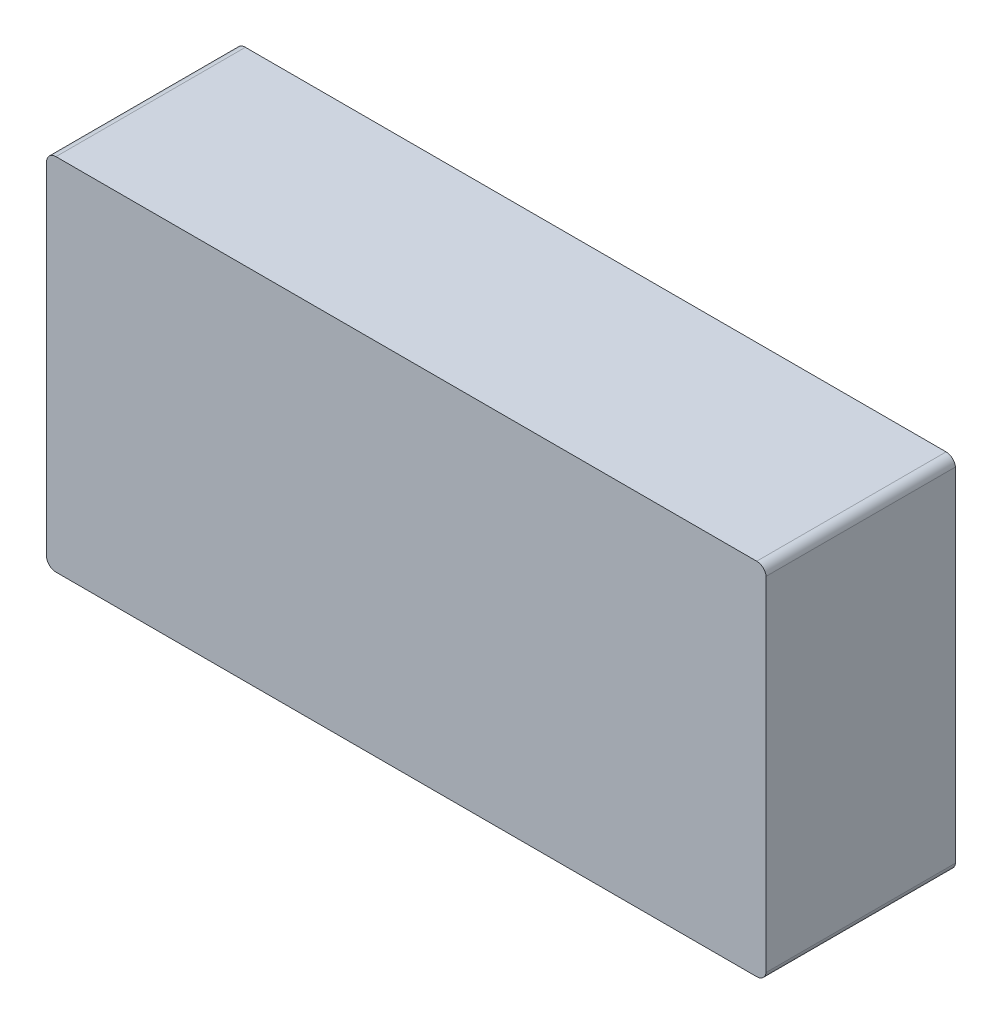
ISO-10303-21;
HEADER;
FILE_DESCRIPTION(('STEP AP214'),'2;1');
FILE_NAME('part.step','',(''),(''),'','','');
FILE_SCHEMA(('AUTOMOTIVE_DESIGN { 1 0 10303 214 1 1 1 1 }'));
ENDSEC;
DATA;
#1=APPLICATION_CONTEXT('core data for automotive mechanical design processes');
#2=APPLICATION_PROTOCOL_DEFINITION('international standard','automotive_design',2000,#1);
#3=PRODUCT_CONTEXT('',#1,'mechanical');
#4=PRODUCT('Part','Part','',(#3));
#5=PRODUCT_RELATED_PRODUCT_CATEGORY('part','',(#4));
#6=PRODUCT_DEFINITION_FORMATION('','',#4);
#7=PRODUCT_DEFINITION_CONTEXT('part definition',#1,'design');
#8=PRODUCT_DEFINITION('design','',#6,#7);
#9=PRODUCT_DEFINITION_SHAPE('','',#8);
#10=(LENGTH_UNIT() NAMED_UNIT(*) SI_UNIT(.MILLI.,.METRE.));
#11=(NAMED_UNIT(*) PLANE_ANGLE_UNIT() SI_UNIT($,.RADIAN.));
#12=(NAMED_UNIT(*) SI_UNIT($,.STERADIAN.) SOLID_ANGLE_UNIT());
#13=UNCERTAINTY_MEASURE_WITH_UNIT(LENGTH_MEASURE(1.E-05),#10,'distance_accuracy_value','');
#14=(GEOMETRIC_REPRESENTATION_CONTEXT(3) GLOBAL_UNCERTAINTY_ASSIGNED_CONTEXT((#13)) GLOBAL_UNIT_ASSIGNED_CONTEXT((#10,
#11,#12)) REPRESENTATION_CONTEXT('',''));
#15=CARTESIAN_POINT('',(0.,0.,0.));
#16=DIRECTION('',(0.,0.,1.));
#17=DIRECTION('',(1.,0.,0.));
#18=AXIS2_PLACEMENT_3D('',#15,#16,#17);
#19=CARTESIAN_POINT('',(0.,0.,10.));
#20=DIRECTION('',(0.,0.,-1.));
#21=DIRECTION('',(-1.,0.,0.));
#22=AXIS2_PLACEMENT_3D('',#19,#20,#21);
#23=PLANE('',#22);
#24=DIRECTION('',(0.,-1.,0.));
#25=VECTOR('',#24,1.);
#26=CARTESIAN_POINT('',(37.9966515153743,0.,10.));
#27=LINE('',#26,#25);
#28=CARTESIAN_POINT('',(37.9966515153743,18.5577691290953,10.));
#29=VERTEX_POINT('',#28);
#30=CARTESIAN_POINT('',(37.9966515153743,0.442230870904673,10.));
#31=VERTEX_POINT('',#30);
#32=EDGE_CURVE('E137',#29,#31,#27,.T.);
#33=ORIENTED_EDGE('',*,*,#32,.F.);
#34=CARTESIAN_POINT('',(37.5,18.5,10.));
#35=DIRECTION('',(0.,0.,-1.));
#36=DIRECTION('',(-1.,0.,0.));
#37=AXIS2_PLACEMENT_3D('',#34,#35,#36);
#38=CIRCLE('',#37,0.5);
#39=CARTESIAN_POINT('',(37.5,19.,10.));
#40=VERTEX_POINT('',#39);
#41=EDGE_CURVE('E176',#29,#40,#38,.F.);
#42=ORIENTED_EDGE('',*,*,#41,.T.);
#43=DIRECTION('',(-1.,0.,0.));
#44=VECTOR('',#43,1.);
#45=CARTESIAN_POINT('',(0.,19.,10.));
#46=LINE('',#45,#44);
#47=CARTESIAN_POINT('',(0.5,19.,10.));
#48=VERTEX_POINT('',#47);
#49=EDGE_CURVE('E218',#40,#48,#46,.T.);
#50=ORIENTED_EDGE('',*,*,#49,.T.);
#51=CARTESIAN_POINT('',(0.5,18.5,10.));
#52=DIRECTION('',(0.,0.,-1.));
#53=DIRECTION('',(-1.,0.,0.));
#54=AXIS2_PLACEMENT_3D('',#51,#52,#53);
#55=CIRCLE('',#54,0.5);
#56=CARTESIAN_POINT('',(0.,18.5,10.));
#57=VERTEX_POINT('',#56);
#58=EDGE_CURVE('E173',#48,#57,#55,.F.);
#59=ORIENTED_EDGE('',*,*,#58,.T.);
#60=DIRECTION('',(0.,-1.,0.));
#61=VECTOR('',#60,1.);
#62=CARTESIAN_POINT('',(0.,0.,10.));
#63=LINE('',#62,#61);
#64=CARTESIAN_POINT('',(0.,0.5,10.));
#65=VERTEX_POINT('',#64);
#66=EDGE_CURVE('E202',#57,#65,#63,.T.);
#67=ORIENTED_EDGE('',*,*,#66,.T.);
#68=CARTESIAN_POINT('',(0.5,0.5,10.));
#69=DIRECTION('',(0.,0.,-1.));
#70=DIRECTION('',(-1.,0.,0.));
#71=AXIS2_PLACEMENT_3D('',#68,#69,#70);
#72=CIRCLE('',#71,0.5);
#73=CARTESIAN_POINT('',(0.5,0.,10.));
#74=VERTEX_POINT('',#73);
#75=EDGE_CURVE('E170',#65,#74,#72,.F.);
#76=ORIENTED_EDGE('',*,*,#75,.T.);
#77=DIRECTION('',(1.,0.,0.));
#78=VECTOR('',#77,1.);
#79=CARTESIAN_POINT('',(0.,0.,10.));
#80=LINE('',#79,#78);
#81=CARTESIAN_POINT('',(37.5,0.,10.));
#82=VERTEX_POINT('',#81);
#83=EDGE_CURVE('E228',#74,#82,#80,.T.);
#84=ORIENTED_EDGE('',*,*,#83,.T.);
#85=CARTESIAN_POINT('',(37.5,0.5,10.));
#86=DIRECTION('',(0.,0.,-1.));
#87=DIRECTION('',(-1.,0.,0.));
#88=AXIS2_PLACEMENT_3D('',#85,#86,#87);
#89=CIRCLE('',#88,0.5);
#90=EDGE_CURVE('E179',#82,#31,#89,.F.);
#91=ORIENTED_EDGE('',*,*,#90,.T.);
#92=EDGE_LOOP('',(#33,#42,#50,#59,#67,#76,#84,#91));
#93=FACE_BOUND('',#92,.T.);
#94=ADVANCED_FACE('F47',(#93),#23,.F.);
#95=CARTESIAN_POINT('',(0.,0.,0.));
#96=DIRECTION('',(0.,0.,-1.));
#97=DIRECTION('',(-1.,0.,0.));
#98=AXIS2_PLACEMENT_3D('',#95,#96,#97);
#99=PLANE('',#98);
#100=CARTESIAN_POINT('',(30.,9.5,0.));
#101=DIRECTION('',(0.,0.,-1.));
#102=DIRECTION('',(-1.,0.,0.));
#103=AXIS2_PLACEMENT_3D('',#100,#101,#102);
#104=CIRCLE('',#103,4.);
#105=CARTESIAN_POINT('',(30.,13.5,0.));
#106=VERTEX_POINT('',#105);
#107=CARTESIAN_POINT('',(30.,5.5,0.));
#108=VERTEX_POINT('',#107);
#109=EDGE_CURVE('E70',#106,#108,#104,.T.);
#110=ORIENTED_EDGE('',*,*,#109,.F.);
#111=DIRECTION('',(1.,0.,0.));
#112=VECTOR('',#111,1.);
#113=CARTESIAN_POINT('',(30.,13.5,0.));
#114=LINE('',#113,#112);
#115=CARTESIAN_POINT('',(8.,13.5,0.));
#116=VERTEX_POINT('',#115);
#117=EDGE_CURVE('E244',#116,#106,#114,.T.);
#118=ORIENTED_EDGE('',*,*,#117,.F.);
#119=CARTESIAN_POINT('',(8.,9.5,0.));
#120=DIRECTION('',(0.,0.,-1.));
#121=DIRECTION('',(-1.,0.,0.));
#122=AXIS2_PLACEMENT_3D('',#119,#120,#121);
#123=CIRCLE('',#122,4.);
#124=CARTESIAN_POINT('',(8.,5.5,0.));
#125=VERTEX_POINT('',#124);
#126=EDGE_CURVE('E249',#125,#116,#123,.T.);
#127=ORIENTED_EDGE('',*,*,#126,.F.);
#128=DIRECTION('',(-1.,0.,0.));
#129=VECTOR('',#128,1.);
#130=CARTESIAN_POINT('',(30.,5.5,0.));
#131=LINE('',#130,#129);
#132=EDGE_CURVE('E253',#108,#125,#131,.T.);
#133=ORIENTED_EDGE('',*,*,#132,.F.);
#134=EDGE_LOOP('',(#110,#118,#127,#133));
#135=FACE_BOUND('',#134,.T.);
#136=CARTESIAN_POINT('',(37.5,18.5,0.));
#137=DIRECTION('',(0.,0.,-1.));
#138=DIRECTION('',(-1.,0.,0.));
#139=AXIS2_PLACEMENT_3D('',#136,#137,#138);
#140=CIRCLE('',#139,0.5);
#141=CARTESIAN_POINT('',(37.5,19.,0.));
#142=VERTEX_POINT('',#141);
#143=CARTESIAN_POINT('',(37.9966515153743,18.5577691290953,0.));
#144=VERTEX_POINT('',#143);
#145=EDGE_CURVE('E151',#142,#144,#140,.T.);
#146=ORIENTED_EDGE('',*,*,#145,.T.);
#147=DIRECTION('',(0.,-1.,0.));
#148=VECTOR('',#147,1.);
#149=CARTESIAN_POINT('',(37.9966515153743,0.,0.));
#150=LINE('',#149,#148);
#151=CARTESIAN_POINT('',(37.9966515153743,0.442230870904673,0.));
#152=VERTEX_POINT('',#151);
#153=EDGE_CURVE('E63',#144,#152,#150,.T.);
#154=ORIENTED_EDGE('',*,*,#153,.T.);
#155=CARTESIAN_POINT('',(37.5,0.5,0.));
#156=DIRECTION('',(0.,0.,-1.));
#157=DIRECTION('',(-1.,0.,0.));
#158=AXIS2_PLACEMENT_3D('',#155,#156,#157);
#159=CIRCLE('',#158,0.5);
#160=CARTESIAN_POINT('',(37.5,0.,0.));
#161=VERTEX_POINT('',#160);
#162=EDGE_CURVE('E148',#152,#161,#159,.T.);
#163=ORIENTED_EDGE('',*,*,#162,.T.);
#164=DIRECTION('',(1.,0.,0.));
#165=VECTOR('',#164,1.);
#166=CARTESIAN_POINT('',(0.,0.,0.));
#167=LINE('',#166,#165);
#168=CARTESIAN_POINT('',(0.5,0.,0.));
#169=VERTEX_POINT('',#168);
#170=EDGE_CURVE('E208',#169,#161,#167,.T.);
#171=ORIENTED_EDGE('',*,*,#170,.F.);
#172=CARTESIAN_POINT('',(0.5,0.5,0.));
#173=DIRECTION('',(0.,0.,-1.));
#174=DIRECTION('',(-1.,0.,0.));
#175=AXIS2_PLACEMENT_3D('',#172,#173,#174);
#176=CIRCLE('',#175,0.5);
#177=CARTESIAN_POINT('',(0.,0.5,0.));
#178=VERTEX_POINT('',#177);
#179=EDGE_CURVE('E206',#169,#178,#176,.T.);
#180=ORIENTED_EDGE('',*,*,#179,.T.);
#181=DIRECTION('',(0.,-1.,0.));
#182=VECTOR('',#181,1.);
#183=CARTESIAN_POINT('',(0.,0.,0.));
#184=LINE('',#183,#182);
#185=CARTESIAN_POINT('',(0.,18.5,0.));
#186=VERTEX_POINT('',#185);
#187=EDGE_CURVE('E199',#186,#178,#184,.T.);
#188=ORIENTED_EDGE('',*,*,#187,.F.);
#189=CARTESIAN_POINT('',(0.5,18.5,0.));
#190=DIRECTION('',(0.,0.,-1.));
#191=DIRECTION('',(-1.,0.,0.));
#192=AXIS2_PLACEMENT_3D('',#189,#190,#191);
#193=CIRCLE('',#192,0.5);
#194=CARTESIAN_POINT('',(0.5,19.,0.));
#195=VERTEX_POINT('',#194);
#196=EDGE_CURVE('E164',#186,#195,#193,.T.);
#197=ORIENTED_EDGE('',*,*,#196,.T.);
#198=DIRECTION('',(-1.,0.,0.));
#199=VECTOR('',#198,1.);
#200=CARTESIAN_POINT('',(0.,19.,0.));
#201=LINE('',#200,#199);
#202=EDGE_CURVE('E213',#142,#195,#201,.T.);
#203=ORIENTED_EDGE('',*,*,#202,.F.);
#204=EDGE_LOOP('',(#146,#154,#163,#171,#180,#188,#197,#203));
#205=FACE_BOUND('',#204,.T.);
#206=ADVANCED_FACE('F146',(#135,#205),#99,.T.);
#207=CARTESIAN_POINT('',(37.5,0.5,10.));
#208=DIRECTION('',(0.,0.,-1.));
#209=DIRECTION('',(-1.,0.,0.));
#210=AXIS2_PLACEMENT_3D('',#207,#208,#209);
#211=CYLINDRICAL_SURFACE('',#210,0.5);
#212=ORIENTED_EDGE('',*,*,#162,.F.);
#213=DIRECTION('',(0.,0.,-1.));
#214=VECTOR('',#213,1.);
#215=CARTESIAN_POINT('',(37.9966515153743,0.442230870904673,10.));
#216=LINE('',#215,#214);
#217=EDGE_CURVE('E134',#152,#31,#216,.F.);
#218=ORIENTED_EDGE('',*,*,#217,.T.);
#219=ORIENTED_EDGE('',*,*,#90,.F.);
#220=DIRECTION('',(0.,0.,-1.));
#221=VECTOR('',#220,1.);
#222=CARTESIAN_POINT('',(37.5,0.,10.));
#223=LINE('',#222,#221);
#224=EDGE_CURVE('E156',#161,#82,#223,.F.);
#225=ORIENTED_EDGE('',*,*,#224,.F.);
#226=EDGE_LOOP('',(#212,#218,#219,#225));
#227=FACE_BOUND('',#226,.T.);
#228=ADVANCED_FACE('F155',(#227),#211,.T.);
#229=CARTESIAN_POINT('',(37.5,18.5,10.));
#230=DIRECTION('',(0.,0.,-1.));
#231=DIRECTION('',(-1.,0.,0.));
#232=AXIS2_PLACEMENT_3D('',#229,#230,#231);
#233=CYLINDRICAL_SURFACE('',#232,0.5);
#234=ORIENTED_EDGE('',*,*,#41,.F.);
#235=DIRECTION('',(0.,0.,-1.));
#236=VECTOR('',#235,1.);
#237=CARTESIAN_POINT('',(37.9966515153743,18.5577691290953,10.));
#238=LINE('',#237,#236);
#239=EDGE_CURVE('E11',#29,#144,#238,.T.);
#240=ORIENTED_EDGE('',*,*,#239,.T.);
#241=ORIENTED_EDGE('',*,*,#145,.F.);
#242=DIRECTION('',(0.,0.,-1.));
#243=VECTOR('',#242,1.);
#244=CARTESIAN_POINT('',(37.5,19.,10.));
#245=LINE('',#244,#243);
#246=EDGE_CURVE('E185',#40,#142,#245,.T.);
#247=ORIENTED_EDGE('',*,*,#246,.F.);
#248=EDGE_LOOP('',(#234,#240,#241,#247));
#249=FACE_BOUND('',#248,.T.);
#250=ADVANCED_FACE('F297',(#249),#233,.T.);
#251=CARTESIAN_POINT('',(0.,0.,10.));
#252=DIRECTION('',(1.,0.,0.));
#253=DIRECTION('',(0.,0.,-1.));
#254=AXIS2_PLACEMENT_3D('',#251,#252,#253);
#255=PLANE('',#254);
#256=ORIENTED_EDGE('',*,*,#66,.F.);
#257=DIRECTION('',(0.,0.,-1.));
#258=VECTOR('',#257,1.);
#259=CARTESIAN_POINT('',(0.,18.5,10.));
#260=LINE('',#259,#258);
#261=EDGE_CURVE('E56',#57,#186,#260,.T.);
#262=ORIENTED_EDGE('',*,*,#261,.T.);
#263=ORIENTED_EDGE('',*,*,#187,.T.);
#264=DIRECTION('',(0.,0.,-1.));
#265=VECTOR('',#264,1.);
#266=CARTESIAN_POINT('',(0.,0.5,10.));
#267=LINE('',#266,#265);
#268=EDGE_CURVE('E189',#178,#65,#267,.F.);
#269=ORIENTED_EDGE('',*,*,#268,.T.);
#270=EDGE_LOOP('',(#256,#262,#263,#269));
#271=FACE_BOUND('',#270,.T.);
#272=ADVANCED_FACE('F198',(#271),#255,.F.);
#273=CARTESIAN_POINT('',(0.,0.,10.));
#274=DIRECTION('',(0.,1.,0.));
#275=DIRECTION('',(0.,0.,1.));
#276=AXIS2_PLACEMENT_3D('',#273,#274,#275);
#277=PLANE('',#276);
#278=ORIENTED_EDGE('',*,*,#170,.T.);
#279=ORIENTED_EDGE('',*,*,#224,.T.);
#280=ORIENTED_EDGE('',*,*,#83,.F.);
#281=DIRECTION('',(0.,0.,-1.));
#282=VECTOR('',#281,1.);
#283=CARTESIAN_POINT('',(0.5,0.,10.));
#284=LINE('',#283,#282);
#285=EDGE_CURVE('E158',#74,#169,#284,.T.);
#286=ORIENTED_EDGE('',*,*,#285,.T.);
#287=EDGE_LOOP('',(#278,#279,#280,#286));
#288=FACE_BOUND('',#287,.T.);
#289=ADVANCED_FACE('F306',(#288),#277,.F.);
#290=CARTESIAN_POINT('',(0.,19.,10.));
#291=DIRECTION('',(0.,-1.,0.));
#292=DIRECTION('',(0.,0.,-1.));
#293=AXIS2_PLACEMENT_3D('',#290,#291,#292);
#294=PLANE('',#293);
#295=ORIENTED_EDGE('',*,*,#49,.F.);
#296=ORIENTED_EDGE('',*,*,#246,.T.);
#297=ORIENTED_EDGE('',*,*,#202,.T.);
#298=DIRECTION('',(0.,0.,-1.));
#299=VECTOR('',#298,1.);
#300=CARTESIAN_POINT('',(0.5,19.,10.));
#301=LINE('',#300,#299);
#302=EDGE_CURVE('E182',#195,#48,#301,.F.);
#303=ORIENTED_EDGE('',*,*,#302,.T.);
#304=EDGE_LOOP('',(#295,#296,#297,#303));
#305=FACE_BOUND('',#304,.T.);
#306=ADVANCED_FACE('F302',(#305),#294,.F.);
#307=CARTESIAN_POINT('',(0.5,18.5,10.));
#308=DIRECTION('',(0.,0.,-1.));
#309=DIRECTION('',(-1.,0.,0.));
#310=AXIS2_PLACEMENT_3D('',#307,#308,#309);
#311=CYLINDRICAL_SURFACE('',#310,0.5);
#312=ORIENTED_EDGE('',*,*,#58,.F.);
#313=ORIENTED_EDGE('',*,*,#302,.F.);
#314=ORIENTED_EDGE('',*,*,#196,.F.);
#315=ORIENTED_EDGE('',*,*,#261,.F.);
#316=EDGE_LOOP('',(#312,#313,#314,#315));
#317=FACE_BOUND('',#316,.T.);
#318=ADVANCED_FACE('F305',(#317),#311,.T.);
#319=CARTESIAN_POINT('',(0.5,0.5,10.));
#320=DIRECTION('',(0.,0.,-1.));
#321=DIRECTION('',(-1.,0.,0.));
#322=AXIS2_PLACEMENT_3D('',#319,#320,#321);
#323=CYLINDRICAL_SURFACE('',#322,0.5);
#324=ORIENTED_EDGE('',*,*,#75,.F.);
#325=ORIENTED_EDGE('',*,*,#268,.F.);
#326=ORIENTED_EDGE('',*,*,#179,.F.);
#327=ORIENTED_EDGE('',*,*,#285,.F.);
#328=EDGE_LOOP('',(#324,#325,#326,#327));
#329=FACE_BOUND('',#328,.T.);
#330=ADVANCED_FACE('F49',(#329),#323,.T.);
#331=CARTESIAN_POINT('',(30.,9.5,1.));
#332=DIRECTION('',(0.,0.,-1.));
#333=DIRECTION('',(-1.,0.,0.));
#334=AXIS2_PLACEMENT_3D('',#331,#332,#333);
#335=CYLINDRICAL_SURFACE('',#334,4.);
#336=ORIENTED_EDGE('',*,*,#109,.T.);
#337=DIRECTION('',(0.,0.,-1.));
#338=VECTOR('',#337,1.);
#339=CARTESIAN_POINT('',(30.,5.5,1.));
#340=LINE('',#339,#338);
#341=CARTESIAN_POINT('',(30.,5.5,1.));
#342=VERTEX_POINT('',#341);
#343=EDGE_CURVE('E235',#342,#108,#340,.T.);
#344=ORIENTED_EDGE('',*,*,#343,.F.);
#345=CARTESIAN_POINT('',(30.,9.5,1.));
#346=DIRECTION('',(0.,0.,-1.));
#347=DIRECTION('',(-1.,0.,0.));
#348=AXIS2_PLACEMENT_3D('',#345,#346,#347);
#349=CIRCLE('',#348,4.);
#350=CARTESIAN_POINT('',(30.,13.5,1.));
#351=VERTEX_POINT('',#350);
#352=EDGE_CURVE('E248',#351,#342,#349,.T.);
#353=ORIENTED_EDGE('',*,*,#352,.F.);
#354=DIRECTION('',(0.,0.,-1.));
#355=VECTOR('',#354,1.);
#356=CARTESIAN_POINT('',(30.,13.5,1.));
#357=LINE('',#356,#355);
#358=EDGE_CURVE('E209',#351,#106,#357,.T.);
#359=ORIENTED_EDGE('',*,*,#358,.T.);
#360=EDGE_LOOP('',(#336,#344,#353,#359));
#361=FACE_BOUND('',#360,.T.);
#362=ADVANCED_FACE('F279',(#361),#335,.F.);
#363=CARTESIAN_POINT('',(30.,13.5,1.));
#364=DIRECTION('',(0.,1.,0.));
#365=DIRECTION('',(-1.,0.,0.));
#366=AXIS2_PLACEMENT_3D('',#363,#364,#365);
#367=PLANE('',#366);
#368=ORIENTED_EDGE('',*,*,#117,.T.);
#369=ORIENTED_EDGE('',*,*,#358,.F.);
#370=DIRECTION('',(1.,0.,0.));
#371=VECTOR('',#370,1.);
#372=CARTESIAN_POINT('',(30.,13.5,1.));
#373=LINE('',#372,#371);
#374=CARTESIAN_POINT('',(8.,13.5,1.));
#375=VERTEX_POINT('',#374);
#376=EDGE_CURVE('E239',#375,#351,#373,.T.);
#377=ORIENTED_EDGE('',*,*,#376,.F.);
#378=DIRECTION('',(0.,0.,-1.));
#379=VECTOR('',#378,1.);
#380=CARTESIAN_POINT('',(8.,13.5,1.));
#381=LINE('',#380,#379);
#382=EDGE_CURVE('E215',#375,#116,#381,.T.);
#383=ORIENTED_EDGE('',*,*,#382,.T.);
#384=EDGE_LOOP('',(#368,#369,#377,#383));
#385=FACE_BOUND('',#384,.T.);
#386=ADVANCED_FACE('F288',(#385),#367,.F.);
#387=CARTESIAN_POINT('',(8.,9.5,1.));
#388=DIRECTION('',(0.,0.,-1.));
#389=DIRECTION('',(-1.,0.,0.));
#390=AXIS2_PLACEMENT_3D('',#387,#388,#389);
#391=CYLINDRICAL_SURFACE('',#390,4.);
#392=ORIENTED_EDGE('',*,*,#126,.T.);
#393=ORIENTED_EDGE('',*,*,#382,.F.);
#394=CARTESIAN_POINT('',(8.,9.5,1.));
#395=DIRECTION('',(0.,0.,-1.));
#396=DIRECTION('',(-1.,0.,0.));
#397=AXIS2_PLACEMENT_3D('',#394,#395,#396);
#398=CIRCLE('',#397,4.);
#399=CARTESIAN_POINT('',(8.,5.5,1.));
#400=VERTEX_POINT('',#399);
#401=EDGE_CURVE('E262',#400,#375,#398,.T.);
#402=ORIENTED_EDGE('',*,*,#401,.F.);
#403=DIRECTION('',(0.,0.,-1.));
#404=VECTOR('',#403,1.);
#405=CARTESIAN_POINT('',(8.,5.5,1.));
#406=LINE('',#405,#404);
#407=EDGE_CURVE('E238',#400,#125,#406,.T.);
#408=ORIENTED_EDGE('',*,*,#407,.T.);
#409=EDGE_LOOP('',(#392,#393,#402,#408));
#410=FACE_BOUND('',#409,.T.);
#411=ADVANCED_FACE('F286',(#410),#391,.F.);
#412=CARTESIAN_POINT('',(30.,5.5,1.));
#413=DIRECTION('',(0.,-1.,0.));
#414=DIRECTION('',(0.,0.,-1.));
#415=AXIS2_PLACEMENT_3D('',#412,#413,#414);
#416=PLANE('',#415);
#417=ORIENTED_EDGE('',*,*,#132,.T.);
#418=ORIENTED_EDGE('',*,*,#407,.F.);
#419=DIRECTION('',(-1.,0.,0.));
#420=VECTOR('',#419,1.);
#421=CARTESIAN_POINT('',(30.,5.5,1.));
#422=LINE('',#421,#420);
#423=EDGE_CURVE('E266',#342,#400,#422,.T.);
#424=ORIENTED_EDGE('',*,*,#423,.F.);
#425=ORIENTED_EDGE('',*,*,#343,.T.);
#426=EDGE_LOOP('',(#417,#418,#424,#425));
#427=FACE_BOUND('',#426,.T.);
#428=ADVANCED_FACE('F282',(#427),#416,.F.);
#429=CARTESIAN_POINT('',(30.,9.5,1.));
#430=DIRECTION('',(0.,0.,-1.));
#431=DIRECTION('',(-1.,0.,0.));
#432=AXIS2_PLACEMENT_3D('',#429,#430,#431);
#433=PLANE('',#432);
#434=ORIENTED_EDGE('',*,*,#352,.T.);
#435=ORIENTED_EDGE('',*,*,#423,.T.);
#436=ORIENTED_EDGE('',*,*,#401,.T.);
#437=ORIENTED_EDGE('',*,*,#376,.T.);
#438=EDGE_LOOP('',(#434,#435,#436,#437));
#439=FACE_BOUND('',#438,.T.);
#440=ADVANCED_FACE('F276',(#439),#433,.T.);
#441=CARTESIAN_POINT('',(37.9966515153743,0.,10.));
#442=DIRECTION('',(1.,0.,0.));
#443=DIRECTION('',(0.,0.,-1.));
#444=AXIS2_PLACEMENT_3D('',#441,#442,#443);
#445=PLANE('',#444);
#446=ORIENTED_EDGE('',*,*,#153,.F.);
#447=ORIENTED_EDGE('',*,*,#239,.F.);
#448=ORIENTED_EDGE('',*,*,#32,.T.);
#449=ORIENTED_EDGE('',*,*,#217,.F.);
#450=EDGE_LOOP('',(#446,#447,#448,#449));
#451=FACE_BOUND('',#450,.T.);
#452=ADVANCED_FACE('F135',(#451),#445,.T.);
#453=CLOSED_SHELL('',(#94,#206,#228,#250,#272,#289,#306,#318,#330,#362,#386,#411,#428,#440,#452));
#454=MANIFOLD_SOLID_BREP('B2',#453);
#455=ADVANCED_BREP_SHAPE_REPRESENTATION('',(#18,#454),#14);
#456=SHAPE_DEFINITION_REPRESENTATION(#9,#455);
ENDSEC;
END-ISO-10303-21;
